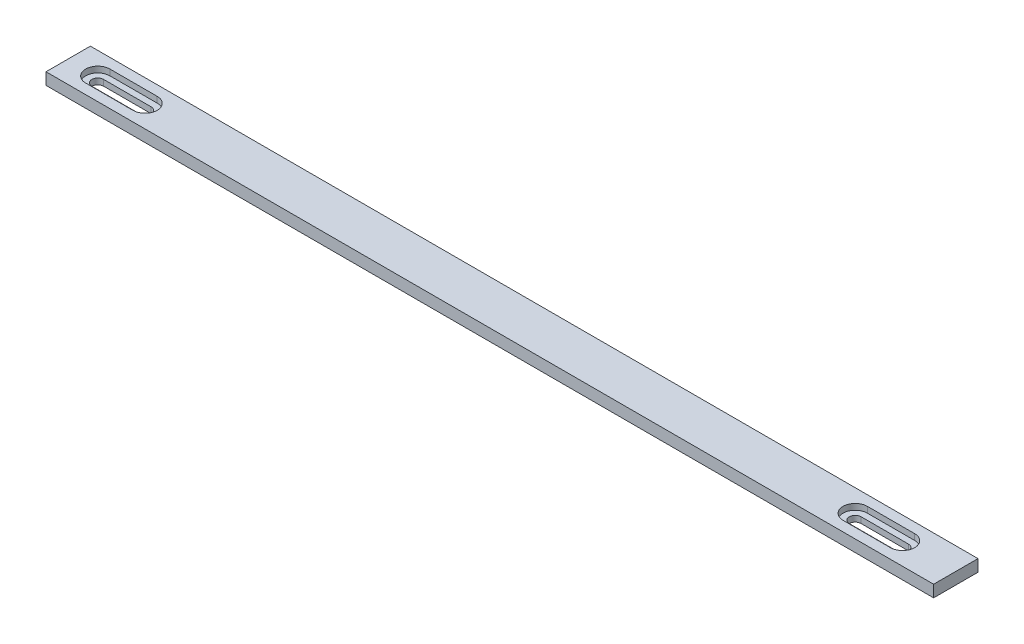
ISO-10303-21;
HEADER;
FILE_DESCRIPTION(('STEP AP214'),'2;1');
FILE_NAME('part.step','',(''),(''),'','','');
FILE_SCHEMA(('AUTOMOTIVE_DESIGN { 1 0 10303 214 1 1 1 1 }'));
ENDSEC;
DATA;
#1=APPLICATION_CONTEXT('core data for automotive mechanical design processes');
#2=APPLICATION_PROTOCOL_DEFINITION('international standard','automotive_design',2000,#1);
#3=PRODUCT_CONTEXT('',#1,'mechanical');
#4=PRODUCT('Part','Part','',(#3));
#5=PRODUCT_RELATED_PRODUCT_CATEGORY('part','',(#4));
#6=PRODUCT_DEFINITION_FORMATION('','',#4);
#7=PRODUCT_DEFINITION_CONTEXT('part definition',#1,'design');
#8=PRODUCT_DEFINITION('design','',#6,#7);
#9=PRODUCT_DEFINITION_SHAPE('','',#8);
#10=(LENGTH_UNIT() NAMED_UNIT(*) SI_UNIT(.MILLI.,.METRE.));
#11=(NAMED_UNIT(*) PLANE_ANGLE_UNIT() SI_UNIT($,.RADIAN.));
#12=(NAMED_UNIT(*) SI_UNIT($,.STERADIAN.) SOLID_ANGLE_UNIT());
#13=UNCERTAINTY_MEASURE_WITH_UNIT(LENGTH_MEASURE(1.E-05),#10,'distance_accuracy_value','');
#14=(GEOMETRIC_REPRESENTATION_CONTEXT(3) GLOBAL_UNCERTAINTY_ASSIGNED_CONTEXT((#13)) GLOBAL_UNIT_ASSIGNED_CONTEXT((#10,
#11,#12)) REPRESENTATION_CONTEXT('',''));
#15=CARTESIAN_POINT('',(0.,0.,0.));
#16=DIRECTION('',(0.,0.,1.));
#17=DIRECTION('',(1.,0.,0.));
#18=AXIS2_PLACEMENT_3D('',#15,#16,#17);
#19=CARTESIAN_POINT('',(266.,-4.,-7.5));
#20=DIRECTION('',(0.,1.,0.));
#21=DIRECTION('',(0.,0.,1.));
#22=AXIS2_PLACEMENT_3D('',#19,#20,#21);
#23=CYLINDRICAL_SURFACE('',#22,2.);
#24=CARTESIAN_POINT('',(266.,-2.,-7.5));
#25=DIRECTION('',(0.,1.,0.));
#26=DIRECTION('',(0.,0.,1.));
#27=AXIS2_PLACEMENT_3D('',#24,#25,#26);
#28=CIRCLE('',#27,2.);
#29=CARTESIAN_POINT('',(266.,-2.,-5.5));
#30=VERTEX_POINT('',#29);
#31=CARTESIAN_POINT('',(266.,-2.,-9.5));
#32=VERTEX_POINT('',#31);
#33=EDGE_CURVE('E284',#30,#32,#28,.F.);
#34=ORIENTED_EDGE('',*,*,#33,.F.);
#35=DIRECTION('',(0.,1.,0.));
#36=VECTOR('',#35,1.);
#37=CARTESIAN_POINT('',(266.,-4.,-5.5));
#38=LINE('',#37,#36);
#39=CARTESIAN_POINT('',(266.,-4.,-5.5));
#40=VERTEX_POINT('',#39);
#41=EDGE_CURVE('E337',#40,#30,#38,.T.);
#42=ORIENTED_EDGE('',*,*,#41,.F.);
#43=CARTESIAN_POINT('',(266.,-4.,-7.5));
#44=DIRECTION('',(0.,1.,0.));
#45=DIRECTION('',(0.,0.,1.));
#46=AXIS2_PLACEMENT_3D('',#43,#44,#45);
#47=CIRCLE('',#46,2.);
#48=CARTESIAN_POINT('',(266.,-4.,-9.5));
#49=VERTEX_POINT('',#48);
#50=EDGE_CURVE('E287',#49,#40,#47,.T.);
#51=ORIENTED_EDGE('',*,*,#50,.F.);
#52=DIRECTION('',(0.,1.,0.));
#53=VECTOR('',#52,1.);
#54=CARTESIAN_POINT('',(266.,-4.,-9.5));
#55=LINE('',#54,#53);
#56=EDGE_CURVE('E293',#49,#32,#55,.T.);
#57=ORIENTED_EDGE('',*,*,#56,.T.);
#58=EDGE_LOOP('',(#34,#42,#51,#57));
#59=FACE_BOUND('',#58,.T.);
#60=ADVANCED_FACE('F39',(#59),#23,.F.);
#61=CARTESIAN_POINT('',(266.,-4.,-9.5));
#62=DIRECTION('',(0.,0.,-1.));
#63=DIRECTION('',(-1.,0.,0.));
#64=AXIS2_PLACEMENT_3D('',#61,#62,#63);
#65=PLANE('',#64);
#66=DIRECTION('',(1.,0.,0.));
#67=VECTOR('',#66,1.);
#68=CARTESIAN_POINT('',(266.,-2.,-9.5));
#69=LINE('',#68,#67);
#70=CARTESIAN_POINT('',(282.,-2.,-9.5));
#71=VERTEX_POINT('',#70);
#72=EDGE_CURVE('E281',#32,#71,#69,.T.);
#73=ORIENTED_EDGE('',*,*,#72,.F.);
#74=ORIENTED_EDGE('',*,*,#56,.F.);
#75=DIRECTION('',(-1.,0.,0.));
#76=VECTOR('',#75,1.);
#77=CARTESIAN_POINT('',(266.,-4.,-9.5));
#78=LINE('',#77,#76);
#79=CARTESIAN_POINT('',(282.,-4.,-9.5));
#80=VERTEX_POINT('',#79);
#81=EDGE_CURVE('E333',#80,#49,#78,.T.);
#82=ORIENTED_EDGE('',*,*,#81,.F.);
#83=DIRECTION('',(0.,1.,0.));
#84=VECTOR('',#83,1.);
#85=CARTESIAN_POINT('',(282.,-4.,-9.5));
#86=LINE('',#85,#84);
#87=EDGE_CURVE('E341',#80,#71,#86,.T.);
#88=ORIENTED_EDGE('',*,*,#87,.T.);
#89=EDGE_LOOP('',(#73,#74,#82,#88));
#90=FACE_BOUND('',#89,.T.);
#91=ADVANCED_FACE('F421',(#90),#65,.F.);
#92=CARTESIAN_POINT('',(282.,-4.,-7.5));
#93=DIRECTION('',(0.,1.,0.));
#94=DIRECTION('',(0.,0.,1.));
#95=AXIS2_PLACEMENT_3D('',#92,#93,#94);
#96=CYLINDRICAL_SURFACE('',#95,2.);
#97=CARTESIAN_POINT('',(282.,-2.,-7.5));
#98=DIRECTION('',(0.,1.,0.));
#99=DIRECTION('',(0.,0.,1.));
#100=AXIS2_PLACEMENT_3D('',#97,#98,#99);
#101=CIRCLE('',#100,2.);
#102=CARTESIAN_POINT('',(282.,-2.,-5.5));
#103=VERTEX_POINT('',#102);
#104=EDGE_CURVE('E278',#71,#103,#101,.F.);
#105=ORIENTED_EDGE('',*,*,#104,.F.);
#106=ORIENTED_EDGE('',*,*,#87,.F.);
#107=CARTESIAN_POINT('',(282.,-4.,-7.5));
#108=DIRECTION('',(0.,1.,0.));
#109=DIRECTION('',(0.,0.,1.));
#110=AXIS2_PLACEMENT_3D('',#107,#108,#109);
#111=CIRCLE('',#110,2.);
#112=CARTESIAN_POINT('',(282.,-4.,-5.5));
#113=VERTEX_POINT('',#112);
#114=EDGE_CURVE('E329',#113,#80,#111,.T.);
#115=ORIENTED_EDGE('',*,*,#114,.F.);
#116=DIRECTION('',(0.,1.,0.));
#117=VECTOR('',#116,1.);
#118=CARTESIAN_POINT('',(282.,-4.,-5.5));
#119=LINE('',#118,#117);
#120=EDGE_CURVE('E345',#113,#103,#119,.T.);
#121=ORIENTED_EDGE('',*,*,#120,.T.);
#122=EDGE_LOOP('',(#105,#106,#115,#121));
#123=FACE_BOUND('',#122,.T.);
#124=ADVANCED_FACE('F427',(#123),#96,.F.);
#125=CARTESIAN_POINT('',(266.,-4.,-5.5));
#126=DIRECTION('',(0.,0.,1.));
#127=DIRECTION('',(1.,0.,0.));
#128=AXIS2_PLACEMENT_3D('',#125,#126,#127);
#129=PLANE('',#128);
#130=DIRECTION('',(-1.,0.,0.));
#131=VECTOR('',#130,1.);
#132=CARTESIAN_POINT('',(266.,-2.,-5.5));
#133=LINE('',#132,#131);
#134=EDGE_CURVE('E11',#103,#30,#133,.T.);
#135=ORIENTED_EDGE('',*,*,#134,.F.);
#136=ORIENTED_EDGE('',*,*,#120,.F.);
#137=DIRECTION('',(1.,0.,0.));
#138=VECTOR('',#137,1.);
#139=CARTESIAN_POINT('',(266.,-4.,-5.5));
#140=LINE('',#139,#138);
#141=EDGE_CURVE('E325',#40,#113,#140,.T.);
#142=ORIENTED_EDGE('',*,*,#141,.F.);
#143=ORIENTED_EDGE('',*,*,#41,.T.);
#144=EDGE_LOOP('',(#135,#136,#142,#143));
#145=FACE_BOUND('',#144,.T.);
#146=ADVANCED_FACE('F433',(#145),#129,.F.);
#147=CARTESIAN_POINT('',(10.,-4.,-7.5));
#148=DIRECTION('',(0.,1.,0.));
#149=DIRECTION('',(0.,0.,1.));
#150=AXIS2_PLACEMENT_3D('',#147,#148,#149);
#151=CYLINDRICAL_SURFACE('',#150,2.);
#152=CARTESIAN_POINT('',(10.,-2.,-7.5));
#153=DIRECTION('',(0.,1.,0.));
#154=DIRECTION('',(0.,0.,1.));
#155=AXIS2_PLACEMENT_3D('',#152,#153,#154);
#156=CIRCLE('',#155,2.);
#157=CARTESIAN_POINT('',(10.,-2.,-5.5));
#158=VERTEX_POINT('',#157);
#159=CARTESIAN_POINT('',(10.,-2.,-9.5));
#160=VERTEX_POINT('',#159);
#161=EDGE_CURVE('E275',#158,#160,#156,.F.);
#162=ORIENTED_EDGE('',*,*,#161,.F.);
#163=DIRECTION('',(0.,1.,0.));
#164=VECTOR('',#163,1.);
#165=CARTESIAN_POINT('',(10.,-4.,-5.5));
#166=LINE('',#165,#164);
#167=CARTESIAN_POINT('',(10.,-4.,-5.5));
#168=VERTEX_POINT('',#167);
#169=EDGE_CURVE('E305',#168,#158,#166,.T.);
#170=ORIENTED_EDGE('',*,*,#169,.F.);
#171=CARTESIAN_POINT('',(10.,-4.,-7.5));
#172=DIRECTION('',(0.,1.,0.));
#173=DIRECTION('',(0.,0.,1.));
#174=AXIS2_PLACEMENT_3D('',#171,#172,#173);
#175=CIRCLE('',#174,2.);
#176=CARTESIAN_POINT('',(10.,-4.,-9.5));
#177=VERTEX_POINT('',#176);
#178=EDGE_CURVE('E288',#177,#168,#175,.T.);
#179=ORIENTED_EDGE('',*,*,#178,.F.);
#180=DIRECTION('',(0.,1.,0.));
#181=VECTOR('',#180,1.);
#182=CARTESIAN_POINT('',(10.,-4.,-9.5));
#183=LINE('',#182,#181);
#184=EDGE_CURVE('E306',#177,#160,#183,.T.);
#185=ORIENTED_EDGE('',*,*,#184,.T.);
#186=EDGE_LOOP('',(#162,#170,#179,#185));
#187=FACE_BOUND('',#186,.T.);
#188=ADVANCED_FACE('F400',(#187),#151,.F.);
#189=CARTESIAN_POINT('',(10.,-4.,-9.5));
#190=DIRECTION('',(0.,0.,-1.));
#191=DIRECTION('',(-1.,0.,0.));
#192=AXIS2_PLACEMENT_3D('',#189,#190,#191);
#193=PLANE('',#192);
#194=DIRECTION('',(1.,0.,0.));
#195=VECTOR('',#194,1.);
#196=CARTESIAN_POINT('',(10.,-2.,-9.5));
#197=LINE('',#196,#195);
#198=CARTESIAN_POINT('',(26.,-2.,-9.5));
#199=VERTEX_POINT('',#198);
#200=EDGE_CURVE('E272',#160,#199,#197,.T.);
#201=ORIENTED_EDGE('',*,*,#200,.F.);
#202=ORIENTED_EDGE('',*,*,#184,.F.);
#203=DIRECTION('',(-1.,0.,0.));
#204=VECTOR('',#203,1.);
#205=CARTESIAN_POINT('',(10.,-4.,-9.5));
#206=LINE('',#205,#204);
#207=CARTESIAN_POINT('',(26.,-4.,-9.5));
#208=VERTEX_POINT('',#207);
#209=EDGE_CURVE('E301',#208,#177,#206,.T.);
#210=ORIENTED_EDGE('',*,*,#209,.F.);
#211=DIRECTION('',(0.,1.,0.));
#212=VECTOR('',#211,1.);
#213=CARTESIAN_POINT('',(26.,-4.,-9.5));
#214=LINE('',#213,#212);
#215=EDGE_CURVE('E311',#208,#199,#214,.T.);
#216=ORIENTED_EDGE('',*,*,#215,.T.);
#217=EDGE_LOOP('',(#201,#202,#210,#216));
#218=FACE_BOUND('',#217,.T.);
#219=ADVANCED_FACE('F409',(#218),#193,.F.);
#220=CARTESIAN_POINT('',(26.,-4.,-7.5));
#221=DIRECTION('',(0.,1.,0.));
#222=DIRECTION('',(0.,0.,1.));
#223=AXIS2_PLACEMENT_3D('',#220,#221,#222);
#224=CYLINDRICAL_SURFACE('',#223,2.);
#225=CARTESIAN_POINT('',(26.,-2.,-7.5));
#226=DIRECTION('',(0.,1.,0.));
#227=DIRECTION('',(0.,0.,1.));
#228=AXIS2_PLACEMENT_3D('',#225,#226,#227);
#229=CIRCLE('',#228,2.);
#230=CARTESIAN_POINT('',(26.,-2.,-5.5));
#231=VERTEX_POINT('',#230);
#232=EDGE_CURVE('E223',#199,#231,#229,.F.);
#233=ORIENTED_EDGE('',*,*,#232,.F.);
#234=ORIENTED_EDGE('',*,*,#215,.F.);
#235=CARTESIAN_POINT('',(26.,-4.,-7.5));
#236=DIRECTION('',(0.,1.,0.));
#237=DIRECTION('',(0.,0.,1.));
#238=AXIS2_PLACEMENT_3D('',#235,#236,#237);
#239=CIRCLE('',#238,2.);
#240=CARTESIAN_POINT('',(26.,-4.,-5.5));
#241=VERTEX_POINT('',#240);
#242=EDGE_CURVE('E297',#241,#208,#239,.T.);
#243=ORIENTED_EDGE('',*,*,#242,.F.);
#244=DIRECTION('',(0.,1.,0.));
#245=VECTOR('',#244,1.);
#246=CARTESIAN_POINT('',(26.,-4.,-5.5));
#247=LINE('',#246,#245);
#248=EDGE_CURVE('E315',#241,#231,#247,.T.);
#249=ORIENTED_EDGE('',*,*,#248,.T.);
#250=EDGE_LOOP('',(#233,#234,#243,#249));
#251=FACE_BOUND('',#250,.T.);
#252=ADVANCED_FACE('F411',(#251),#224,.F.);
#253=CARTESIAN_POINT('',(10.,-4.,-5.5));
#254=DIRECTION('',(0.,0.,1.));
#255=DIRECTION('',(1.,0.,0.));
#256=AXIS2_PLACEMENT_3D('',#253,#254,#255);
#257=PLANE('',#256);
#258=DIRECTION('',(-1.,0.,0.));
#259=VECTOR('',#258,1.);
#260=CARTESIAN_POINT('',(10.,-2.,-5.5));
#261=LINE('',#260,#259);
#262=EDGE_CURVE('E48',#231,#158,#261,.T.);
#263=ORIENTED_EDGE('',*,*,#262,.F.);
#264=ORIENTED_EDGE('',*,*,#248,.F.);
#265=DIRECTION('',(1.,0.,0.));
#266=VECTOR('',#265,1.);
#267=CARTESIAN_POINT('',(10.,-4.,-5.5));
#268=LINE('',#267,#266);
#269=EDGE_CURVE('E292',#168,#241,#268,.T.);
#270=ORIENTED_EDGE('',*,*,#269,.F.);
#271=ORIENTED_EDGE('',*,*,#169,.T.);
#272=EDGE_LOOP('',(#263,#264,#270,#271));
#273=FACE_BOUND('',#272,.T.);
#274=ADVANCED_FACE('F403',(#273),#257,.F.);
#275=CARTESIAN_POINT('',(300.,0.,-15.));
#276=DIRECTION('',(0.,-1.,0.));
#277=DIRECTION('',(0.,0.,-1.));
#278=AXIS2_PLACEMENT_3D('',#275,#276,#277);
#279=PLANE('',#278);
#280=DIRECTION('',(1.,0.,0.));
#281=VECTOR('',#280,1.);
#282=CARTESIAN_POINT('',(10.,0.,-3.4));
#283=LINE('',#282,#281);
#284=CARTESIAN_POINT('',(9.99999999999995,0.,-3.4));
#285=VERTEX_POINT('',#284);
#286=CARTESIAN_POINT('',(26.,0.,-3.4));
#287=VERTEX_POINT('',#286);
#288=EDGE_CURVE('E213',#285,#287,#283,.T.);
#289=ORIENTED_EDGE('',*,*,#288,.F.);
#290=CARTESIAN_POINT('',(10.,0.,-7.5));
#291=DIRECTION('',(0.,1.,0.));
#292=DIRECTION('',(0.,0.,1.));
#293=AXIS2_PLACEMENT_3D('',#290,#291,#292);
#294=CIRCLE('',#293,4.1);
#295=CARTESIAN_POINT('',(10.,0.,-11.6));
#296=VERTEX_POINT('',#295);
#297=EDGE_CURVE('E55',#296,#285,#294,.T.);
#298=ORIENTED_EDGE('',*,*,#297,.F.);
#299=DIRECTION('',(-1.,0.,0.));
#300=VECTOR('',#299,1.);
#301=CARTESIAN_POINT('',(10.,0.,-11.6));
#302=LINE('',#301,#300);
#303=CARTESIAN_POINT('',(26.,0.,-11.6));
#304=VERTEX_POINT('',#303);
#305=EDGE_CURVE('E200',#304,#296,#302,.T.);
#306=ORIENTED_EDGE('',*,*,#305,.F.);
#307=CARTESIAN_POINT('',(26.,0.,-7.5));
#308=DIRECTION('',(0.,1.,0.));
#309=DIRECTION('',(0.,0.,1.));
#310=AXIS2_PLACEMENT_3D('',#307,#308,#309);
#311=CIRCLE('',#310,4.1);
#312=EDGE_CURVE('E204',#287,#304,#311,.T.);
#313=ORIENTED_EDGE('',*,*,#312,.F.);
#314=EDGE_LOOP('',(#289,#298,#306,#313));
#315=FACE_BOUND('',#314,.T.);
#316=DIRECTION('',(1.,0.,0.));
#317=VECTOR('',#316,1.);
#318=CARTESIAN_POINT('',(266.,0.,-3.4));
#319=LINE('',#318,#317);
#320=CARTESIAN_POINT('',(266.,0.,-3.4));
#321=VERTEX_POINT('',#320);
#322=CARTESIAN_POINT('',(282.,0.,-3.4));
#323=VERTEX_POINT('',#322);
#324=EDGE_CURVE('E249',#321,#323,#319,.T.);
#325=ORIENTED_EDGE('',*,*,#324,.F.);
#326=CARTESIAN_POINT('',(266.,0.,-7.5));
#327=DIRECTION('',(0.,1.,0.));
#328=DIRECTION('',(0.,0.,1.));
#329=AXIS2_PLACEMENT_3D('',#326,#327,#328);
#330=CIRCLE('',#329,4.1);
#331=CARTESIAN_POINT('',(266.,0.,-11.6));
#332=VERTEX_POINT('',#331);
#333=EDGE_CURVE('E63',#332,#321,#330,.T.);
#334=ORIENTED_EDGE('',*,*,#333,.F.);
#335=DIRECTION('',(-1.,0.,0.));
#336=VECTOR('',#335,1.);
#337=CARTESIAN_POINT('',(266.,0.,-11.6));
#338=LINE('',#337,#336);
#339=CARTESIAN_POINT('',(282.,0.,-11.6));
#340=VERTEX_POINT('',#339);
#341=EDGE_CURVE('E234',#340,#332,#338,.T.);
#342=ORIENTED_EDGE('',*,*,#341,.F.);
#343=CARTESIAN_POINT('',(282.,0.,-7.5));
#344=DIRECTION('',(0.,1.,0.));
#345=DIRECTION('',(0.,0.,1.));
#346=AXIS2_PLACEMENT_3D('',#343,#344,#345);
#347=CIRCLE('',#346,4.1);
#348=EDGE_CURVE('E253',#323,#340,#347,.T.);
#349=ORIENTED_EDGE('',*,*,#348,.F.);
#350=EDGE_LOOP('',(#325,#334,#342,#349));
#351=FACE_BOUND('',#350,.T.);
#352=DIRECTION('',(0.,0.,1.));
#353=VECTOR('',#352,1.);
#354=CARTESIAN_POINT('',(0.,0.,-15.));
#355=LINE('',#354,#353);
#356=CARTESIAN_POINT('',(0.,0.,-15.));
#357=VERTEX_POINT('',#356);
#358=CARTESIAN_POINT('',(0.,0.,0.));
#359=VERTEX_POINT('',#358);
#360=EDGE_CURVE('E310',#357,#359,#355,.T.);
#361=ORIENTED_EDGE('',*,*,#360,.T.);
#362=DIRECTION('',(-1.,0.,0.));
#363=VECTOR('',#362,1.);
#364=CARTESIAN_POINT('',(300.,0.,0.));
#365=LINE('',#364,#363);
#366=CARTESIAN_POINT('',(300.,0.,0.));
#367=VERTEX_POINT('',#366);
#368=EDGE_CURVE('E389',#367,#359,#365,.T.);
#369=ORIENTED_EDGE('',*,*,#368,.F.);
#370=DIRECTION('',(0.,0.,1.));
#371=VECTOR('',#370,1.);
#372=CARTESIAN_POINT('',(300.,0.,-15.));
#373=LINE('',#372,#371);
#374=CARTESIAN_POINT('',(300.,0.,-15.));
#375=VERTEX_POINT('',#374);
#376=EDGE_CURVE('E352',#375,#367,#373,.T.);
#377=ORIENTED_EDGE('',*,*,#376,.F.);
#378=DIRECTION('',(-1.,0.,0.));
#379=VECTOR('',#378,1.);
#380=CARTESIAN_POINT('',(300.,0.,-15.));
#381=LINE('',#380,#379);
#382=EDGE_CURVE('E366',#375,#357,#381,.T.);
#383=ORIENTED_EDGE('',*,*,#382,.T.);
#384=EDGE_LOOP('',(#361,#369,#377,#383));
#385=FACE_BOUND('',#384,.T.);
#386=ADVANCED_FACE('F41',(#315,#351,#385),#279,.F.);
#387=CARTESIAN_POINT('',(300.,0.,0.));
#388=DIRECTION('',(0.,0.,-1.));
#389=DIRECTION('',(0.,1.,0.));
#390=AXIS2_PLACEMENT_3D('',#387,#388,#389);
#391=PLANE('',#390);
#392=DIRECTION('',(0.,-1.,0.));
#393=VECTOR('',#392,1.);
#394=CARTESIAN_POINT('',(0.,0.,0.));
#395=LINE('',#394,#393);
#396=CARTESIAN_POINT('',(0.,-4.,0.));
#397=VERTEX_POINT('',#396);
#398=EDGE_CURVE('E370',#359,#397,#395,.T.);
#399=ORIENTED_EDGE('',*,*,#398,.T.);
#400=DIRECTION('',(-1.,0.,0.));
#401=VECTOR('',#400,1.);
#402=CARTESIAN_POINT('',(300.,-4.,0.));
#403=LINE('',#402,#401);
#404=CARTESIAN_POINT('',(300.,-4.,0.));
#405=VERTEX_POINT('',#404);
#406=EDGE_CURVE('E385',#405,#397,#403,.T.);
#407=ORIENTED_EDGE('',*,*,#406,.F.);
#408=DIRECTION('',(0.,-1.,0.));
#409=VECTOR('',#408,1.);
#410=CARTESIAN_POINT('',(300.,0.,0.));
#411=LINE('',#410,#409);
#412=EDGE_CURVE('E356',#367,#405,#411,.T.);
#413=ORIENTED_EDGE('',*,*,#412,.F.);
#414=ORIENTED_EDGE('',*,*,#368,.T.);
#415=EDGE_LOOP('',(#399,#407,#413,#414));
#416=FACE_BOUND('',#415,.T.);
#417=ADVANCED_FACE('F448',(#416),#391,.F.);
#418=CARTESIAN_POINT('',(300.,-4.,0.));
#419=DIRECTION('',(0.,1.,0.));
#420=DIRECTION('',(0.,0.,1.));
#421=AXIS2_PLACEMENT_3D('',#418,#419,#420);
#422=PLANE('',#421);
#423=ORIENTED_EDGE('',*,*,#209,.T.);
#424=ORIENTED_EDGE('',*,*,#178,.T.);
#425=ORIENTED_EDGE('',*,*,#269,.T.);
#426=ORIENTED_EDGE('',*,*,#242,.T.);
#427=EDGE_LOOP('',(#423,#424,#425,#426));
#428=FACE_BOUND('',#427,.T.);
#429=ORIENTED_EDGE('',*,*,#81,.T.);
#430=ORIENTED_EDGE('',*,*,#50,.T.);
#431=ORIENTED_EDGE('',*,*,#141,.T.);
#432=ORIENTED_EDGE('',*,*,#114,.T.);
#433=EDGE_LOOP('',(#429,#430,#431,#432));
#434=FACE_BOUND('',#433,.T.);
#435=DIRECTION('',(0.,0.,-1.));
#436=VECTOR('',#435,1.);
#437=CARTESIAN_POINT('',(0.,-4.,0.));
#438=LINE('',#437,#436);
#439=CARTESIAN_POINT('',(0.,-4.,-15.));
#440=VERTEX_POINT('',#439);
#441=EDGE_CURVE('E373',#397,#440,#438,.T.);
#442=ORIENTED_EDGE('',*,*,#441,.T.);
#443=DIRECTION('',(-1.,0.,0.));
#444=VECTOR('',#443,1.);
#445=CARTESIAN_POINT('',(300.,-4.,-15.));
#446=LINE('',#445,#444);
#447=CARTESIAN_POINT('',(300.,-4.,-15.));
#448=VERTEX_POINT('',#447);
#449=EDGE_CURVE('E381',#448,#440,#446,.T.);
#450=ORIENTED_EDGE('',*,*,#449,.F.);
#451=DIRECTION('',(0.,0.,-1.));
#452=VECTOR('',#451,1.);
#453=CARTESIAN_POINT('',(300.,-4.,0.));
#454=LINE('',#453,#452);
#455=EDGE_CURVE('E360',#405,#448,#454,.T.);
#456=ORIENTED_EDGE('',*,*,#455,.F.);
#457=ORIENTED_EDGE('',*,*,#406,.T.);
#458=EDGE_LOOP('',(#442,#450,#456,#457));
#459=FACE_BOUND('',#458,.T.);
#460=ADVANCED_FACE('F405',(#428,#434,#459),#422,.F.);
#461=CARTESIAN_POINT('',(300.,-4.,-15.));
#462=DIRECTION('',(0.,0.,1.));
#463=DIRECTION('',(1.,0.,0.));
#464=AXIS2_PLACEMENT_3D('',#461,#462,#463);
#465=PLANE('',#464);
#466=DIRECTION('',(0.,1.,0.));
#467=VECTOR('',#466,1.);
#468=CARTESIAN_POINT('',(0.,-4.,-15.));
#469=LINE('',#468,#467);
#470=EDGE_CURVE('E357',#440,#357,#469,.T.);
#471=ORIENTED_EDGE('',*,*,#470,.T.);
#472=ORIENTED_EDGE('',*,*,#382,.F.);
#473=DIRECTION('',(0.,1.,0.));
#474=VECTOR('',#473,1.);
#475=CARTESIAN_POINT('',(300.,-4.,-15.));
#476=LINE('',#475,#474);
#477=EDGE_CURVE('E363',#448,#375,#476,.T.);
#478=ORIENTED_EDGE('',*,*,#477,.F.);
#479=ORIENTED_EDGE('',*,*,#449,.T.);
#480=EDGE_LOOP('',(#471,#472,#478,#479));
#481=FACE_BOUND('',#480,.T.);
#482=ADVANCED_FACE('F439',(#481),#465,.F.);
#483=CARTESIAN_POINT('',(300.,0.,0.));
#484=DIRECTION('',(1.,0.,0.));
#485=DIRECTION('',(0.,0.,-1.));
#486=AXIS2_PLACEMENT_3D('',#483,#484,#485);
#487=PLANE('',#486);
#488=ORIENTED_EDGE('',*,*,#376,.T.);
#489=ORIENTED_EDGE('',*,*,#412,.T.);
#490=ORIENTED_EDGE('',*,*,#455,.T.);
#491=ORIENTED_EDGE('',*,*,#477,.T.);
#492=EDGE_LOOP('',(#488,#489,#490,#491));
#493=FACE_BOUND('',#492,.T.);
#494=ADVANCED_FACE('F435',(#493),#487,.T.);
#495=CARTESIAN_POINT('',(0.,0.,0.));
#496=DIRECTION('',(1.,0.,0.));
#497=DIRECTION('',(0.,0.,-1.));
#498=AXIS2_PLACEMENT_3D('',#495,#496,#497);
#499=PLANE('',#498);
#500=ORIENTED_EDGE('',*,*,#360,.F.);
#501=ORIENTED_EDGE('',*,*,#470,.F.);
#502=ORIENTED_EDGE('',*,*,#441,.F.);
#503=ORIENTED_EDGE('',*,*,#398,.F.);
#504=EDGE_LOOP('',(#500,#501,#502,#503));
#505=FACE_BOUND('',#504,.T.);
#506=ADVANCED_FACE('F438',(#505),#499,.F.);
#507=CARTESIAN_POINT('',(10.,-2.,-7.5));
#508=DIRECTION('',(0.,1.,0.));
#509=DIRECTION('',(0.,0.,1.));
#510=AXIS2_PLACEMENT_3D('',#507,#508,#509);
#511=PLANE('',#510);
#512=CARTESIAN_POINT('',(10.,-2.,-7.5));
#513=DIRECTION('',(0.,1.,0.));
#514=DIRECTION('',(0.,0.,1.));
#515=AXIS2_PLACEMENT_3D('',#512,#513,#514);
#516=CIRCLE('',#515,4.1);
#517=CARTESIAN_POINT('',(10.,-2.,-11.6));
#518=VERTEX_POINT('',#517);
#519=CARTESIAN_POINT('',(10.,-2.,-3.4));
#520=VERTEX_POINT('',#519);
#521=EDGE_CURVE('E178',#518,#520,#516,.T.);
#522=ORIENTED_EDGE('',*,*,#521,.T.);
#523=DIRECTION('',(1.,0.,0.));
#524=VECTOR('',#523,1.);
#525=CARTESIAN_POINT('',(10.,-2.,-3.4));
#526=LINE('',#525,#524);
#527=CARTESIAN_POINT('',(26.,-2.,-3.4));
#528=VERTEX_POINT('',#527);
#529=EDGE_CURVE('E188',#520,#528,#526,.T.);
#530=ORIENTED_EDGE('',*,*,#529,.T.);
#531=CARTESIAN_POINT('',(26.,-2.,-7.5));
#532=DIRECTION('',(0.,1.,0.));
#533=DIRECTION('',(0.,0.,1.));
#534=AXIS2_PLACEMENT_3D('',#531,#532,#533);
#535=CIRCLE('',#534,4.1);
#536=CARTESIAN_POINT('',(26.,-2.,-11.6));
#537=VERTEX_POINT('',#536);
#538=EDGE_CURVE('E194',#528,#537,#535,.T.);
#539=ORIENTED_EDGE('',*,*,#538,.T.);
#540=DIRECTION('',(-1.,0.,0.));
#541=VECTOR('',#540,1.);
#542=CARTESIAN_POINT('',(10.,-2.,-11.6));
#543=LINE('',#542,#541);
#544=EDGE_CURVE('E185',#537,#518,#543,.T.);
#545=ORIENTED_EDGE('',*,*,#544,.T.);
#546=EDGE_LOOP('',(#522,#530,#539,#545));
#547=FACE_BOUND('',#546,.T.);
#548=ORIENTED_EDGE('',*,*,#161,.T.);
#549=ORIENTED_EDGE('',*,*,#200,.T.);
#550=ORIENTED_EDGE('',*,*,#232,.T.);
#551=ORIENTED_EDGE('',*,*,#262,.T.);
#552=EDGE_LOOP('',(#548,#549,#550,#551));
#553=FACE_BOUND('',#552,.T.);
#554=ADVANCED_FACE('F196',(#547,#553),#511,.T.);
#555=CARTESIAN_POINT('',(10.,-2.,-7.5));
#556=DIRECTION('',(0.,1.,0.));
#557=DIRECTION('',(0.,0.,1.));
#558=AXIS2_PLACEMENT_3D('',#555,#556,#557);
#559=CYLINDRICAL_SURFACE('',#558,4.1);
#560=ORIENTED_EDGE('',*,*,#297,.T.);
#561=DIRECTION('',(0.,1.,0.));
#562=VECTOR('',#561,1.);
#563=CARTESIAN_POINT('',(10.,-2.,-3.4));
#564=LINE('',#563,#562);
#565=EDGE_CURVE('E174',#520,#285,#564,.T.);
#566=ORIENTED_EDGE('',*,*,#565,.F.);
#567=ORIENTED_EDGE('',*,*,#521,.F.);
#568=DIRECTION('',(0.,1.,0.));
#569=VECTOR('',#568,1.);
#570=CARTESIAN_POINT('',(10.,-2.,-11.6));
#571=LINE('',#570,#569);
#572=EDGE_CURVE('E220',#518,#296,#571,.T.);
#573=ORIENTED_EDGE('',*,*,#572,.T.);
#574=EDGE_LOOP('',(#560,#566,#567,#573));
#575=FACE_BOUND('',#574,.T.);
#576=ADVANCED_FACE('F176',(#575),#559,.F.);
#577=CARTESIAN_POINT('',(10.,-2.,-11.6));
#578=DIRECTION('',(0.,0.,-1.));
#579=DIRECTION('',(0.,1.,0.));
#580=AXIS2_PLACEMENT_3D('',#577,#578,#579);
#581=PLANE('',#580);
#582=ORIENTED_EDGE('',*,*,#305,.T.);
#583=ORIENTED_EDGE('',*,*,#572,.F.);
#584=ORIENTED_EDGE('',*,*,#544,.F.);
#585=DIRECTION('',(0.,1.,0.));
#586=VECTOR('',#585,1.);
#587=CARTESIAN_POINT('',(26.,-2.,-11.6));
#588=LINE('',#587,#586);
#589=EDGE_CURVE('E224',#537,#304,#588,.T.);
#590=ORIENTED_EDGE('',*,*,#589,.T.);
#591=EDGE_LOOP('',(#582,#583,#584,#590));
#592=FACE_BOUND('',#591,.T.);
#593=ADVANCED_FACE('F509',(#592),#581,.F.);
#594=CARTESIAN_POINT('',(26.,-2.,-7.5));
#595=DIRECTION('',(0.,1.,0.));
#596=DIRECTION('',(0.,0.,1.));
#597=AXIS2_PLACEMENT_3D('',#594,#595,#596);
#598=CYLINDRICAL_SURFACE('',#597,4.1);
#599=ORIENTED_EDGE('',*,*,#312,.T.);
#600=ORIENTED_EDGE('',*,*,#589,.F.);
#601=ORIENTED_EDGE('',*,*,#538,.F.);
#602=DIRECTION('',(0.,1.,0.));
#603=VECTOR('',#602,1.);
#604=CARTESIAN_POINT('',(26.,-2.,-3.4));
#605=LINE('',#604,#603);
#606=EDGE_CURVE('E184',#528,#287,#605,.T.);
#607=ORIENTED_EDGE('',*,*,#606,.T.);
#608=EDGE_LOOP('',(#599,#600,#601,#607));
#609=FACE_BOUND('',#608,.T.);
#610=ADVANCED_FACE('F505',(#609),#598,.F.);
#611=CARTESIAN_POINT('',(10.,-2.,-3.4));
#612=DIRECTION('',(0.,0.,1.));
#613=DIRECTION('',(0.,-1.,0.));
#614=AXIS2_PLACEMENT_3D('',#611,#612,#613);
#615=PLANE('',#614);
#616=ORIENTED_EDGE('',*,*,#288,.T.);
#617=ORIENTED_EDGE('',*,*,#606,.F.);
#618=ORIENTED_EDGE('',*,*,#529,.F.);
#619=ORIENTED_EDGE('',*,*,#565,.T.);
#620=EDGE_LOOP('',(#616,#617,#618,#619));
#621=FACE_BOUND('',#620,.T.);
#622=ADVANCED_FACE('F189',(#621),#615,.F.);
#623=CARTESIAN_POINT('',(266.,-2.,-7.5));
#624=DIRECTION('',(0.,1.,0.));
#625=DIRECTION('',(0.,0.,1.));
#626=AXIS2_PLACEMENT_3D('',#623,#624,#625);
#627=PLANE('',#626);
#628=CARTESIAN_POINT('',(266.,-2.,-7.5));
#629=DIRECTION('',(0.,1.,0.));
#630=DIRECTION('',(0.,0.,1.));
#631=AXIS2_PLACEMENT_3D('',#628,#629,#630);
#632=CIRCLE('',#631,4.1);
#633=CARTESIAN_POINT('',(266.,-2.,-11.6));
#634=VERTEX_POINT('',#633);
#635=CARTESIAN_POINT('',(266.,-2.,-3.4));
#636=VERTEX_POINT('',#635);
#637=EDGE_CURVE('E229',#634,#636,#632,.T.);
#638=ORIENTED_EDGE('',*,*,#637,.T.);
#639=DIRECTION('',(1.,0.,0.));
#640=VECTOR('',#639,1.);
#641=CARTESIAN_POINT('',(266.,-2.,-3.4));
#642=LINE('',#641,#640);
#643=CARTESIAN_POINT('',(282.,-2.,-3.4));
#644=VERTEX_POINT('',#643);
#645=EDGE_CURVE('E233',#636,#644,#642,.T.);
#646=ORIENTED_EDGE('',*,*,#645,.T.);
#647=CARTESIAN_POINT('',(282.,-2.,-7.5));
#648=DIRECTION('',(0.,1.,0.));
#649=DIRECTION('',(0.,0.,1.));
#650=AXIS2_PLACEMENT_3D('',#647,#648,#649);
#651=CIRCLE('',#650,4.1);
#652=CARTESIAN_POINT('',(282.,-2.,-11.6));
#653=VERTEX_POINT('',#652);
#654=EDGE_CURVE('E238',#644,#653,#651,.T.);
#655=ORIENTED_EDGE('',*,*,#654,.T.);
#656=DIRECTION('',(-1.,0.,0.));
#657=VECTOR('',#656,1.);
#658=CARTESIAN_POINT('',(266.,-2.,-11.6));
#659=LINE('',#658,#657);
#660=EDGE_CURVE('E242',#653,#634,#659,.T.);
#661=ORIENTED_EDGE('',*,*,#660,.T.);
#662=EDGE_LOOP('',(#638,#646,#655,#661));
#663=FACE_BOUND('',#662,.T.);
#664=ORIENTED_EDGE('',*,*,#33,.T.);
#665=ORIENTED_EDGE('',*,*,#72,.T.);
#666=ORIENTED_EDGE('',*,*,#104,.T.);
#667=ORIENTED_EDGE('',*,*,#134,.T.);
#668=EDGE_LOOP('',(#664,#665,#666,#667));
#669=FACE_BOUND('',#668,.T.);
#670=ADVANCED_FACE('F482',(#663,#669),#627,.T.);
#671=CARTESIAN_POINT('',(266.,-2.,-7.5));
#672=DIRECTION('',(0.,1.,0.));
#673=DIRECTION('',(0.,0.,1.));
#674=AXIS2_PLACEMENT_3D('',#671,#672,#673);
#675=CYLINDRICAL_SURFACE('',#674,4.1);
#676=ORIENTED_EDGE('',*,*,#333,.T.);
#677=DIRECTION('',(0.,1.,0.));
#678=VECTOR('',#677,1.);
#679=CARTESIAN_POINT('',(266.,-2.,-3.4));
#680=LINE('',#679,#678);
#681=EDGE_CURVE('E246',#636,#321,#680,.T.);
#682=ORIENTED_EDGE('',*,*,#681,.F.);
#683=ORIENTED_EDGE('',*,*,#637,.F.);
#684=DIRECTION('',(0.,1.,0.));
#685=VECTOR('',#684,1.);
#686=CARTESIAN_POINT('',(266.,-2.,-11.6));
#687=LINE('',#686,#685);
#688=EDGE_CURVE('E214',#634,#332,#687,.T.);
#689=ORIENTED_EDGE('',*,*,#688,.T.);
#690=EDGE_LOOP('',(#676,#682,#683,#689));
#691=FACE_BOUND('',#690,.T.);
#692=ADVANCED_FACE('F479',(#691),#675,.F.);
#693=CARTESIAN_POINT('',(266.,-2.,-11.6));
#694=DIRECTION('',(0.,0.,-1.));
#695=DIRECTION('',(0.,1.,0.));
#696=AXIS2_PLACEMENT_3D('',#693,#694,#695);
#697=PLANE('',#696);
#698=ORIENTED_EDGE('',*,*,#341,.T.);
#699=ORIENTED_EDGE('',*,*,#688,.F.);
#700=ORIENTED_EDGE('',*,*,#660,.F.);
#701=DIRECTION('',(0.,1.,0.));
#702=VECTOR('',#701,1.);
#703=CARTESIAN_POINT('',(282.,-2.,-11.6));
#704=LINE('',#703,#702);
#705=EDGE_CURVE('E262',#653,#340,#704,.T.);
#706=ORIENTED_EDGE('',*,*,#705,.T.);
#707=EDGE_LOOP('',(#698,#699,#700,#706));
#708=FACE_BOUND('',#707,.T.);
#709=ADVANCED_FACE('F485',(#708),#697,.F.);
#710=CARTESIAN_POINT('',(282.,-2.,-7.5));
#711=DIRECTION('',(0.,1.,0.));
#712=DIRECTION('',(0.,0.,1.));
#713=AXIS2_PLACEMENT_3D('',#710,#711,#712);
#714=CYLINDRICAL_SURFACE('',#713,4.1);
#715=ORIENTED_EDGE('',*,*,#348,.T.);
#716=ORIENTED_EDGE('',*,*,#705,.F.);
#717=ORIENTED_EDGE('',*,*,#654,.F.);
#718=DIRECTION('',(0.,1.,0.));
#719=VECTOR('',#718,1.);
#720=CARTESIAN_POINT('',(282.,-2.,-3.4));
#721=LINE('',#720,#719);
#722=EDGE_CURVE('E265',#644,#323,#721,.T.);
#723=ORIENTED_EDGE('',*,*,#722,.T.);
#724=EDGE_LOOP('',(#715,#716,#717,#723));
#725=FACE_BOUND('',#724,.T.);
#726=ADVANCED_FACE('F487',(#725),#714,.F.);
#727=CARTESIAN_POINT('',(266.,-2.,-3.4));
#728=DIRECTION('',(0.,0.,1.));
#729=DIRECTION('',(0.,-1.,0.));
#730=AXIS2_PLACEMENT_3D('',#727,#728,#729);
#731=PLANE('',#730);
#732=ORIENTED_EDGE('',*,*,#324,.T.);
#733=ORIENTED_EDGE('',*,*,#722,.F.);
#734=ORIENTED_EDGE('',*,*,#645,.F.);
#735=ORIENTED_EDGE('',*,*,#681,.T.);
#736=EDGE_LOOP('',(#732,#733,#734,#735));
#737=FACE_BOUND('',#736,.T.);
#738=ADVANCED_FACE('F475',(#737),#731,.F.);
#739=CLOSED_SHELL('',(#60,#91,#124,#146,#188,#219,#252,#274,#386,#417,#460,#482,#494,#506,#554,
#576,#593,#610,#622,#670,#692,#709,#726,#738));
#740=MANIFOLD_SOLID_BREP('B2',#739);
#741=ADVANCED_BREP_SHAPE_REPRESENTATION('',(#18,#740),#14);
#742=SHAPE_DEFINITION_REPRESENTATION(#9,#741);
ENDSEC;
END-ISO-10303-21;
